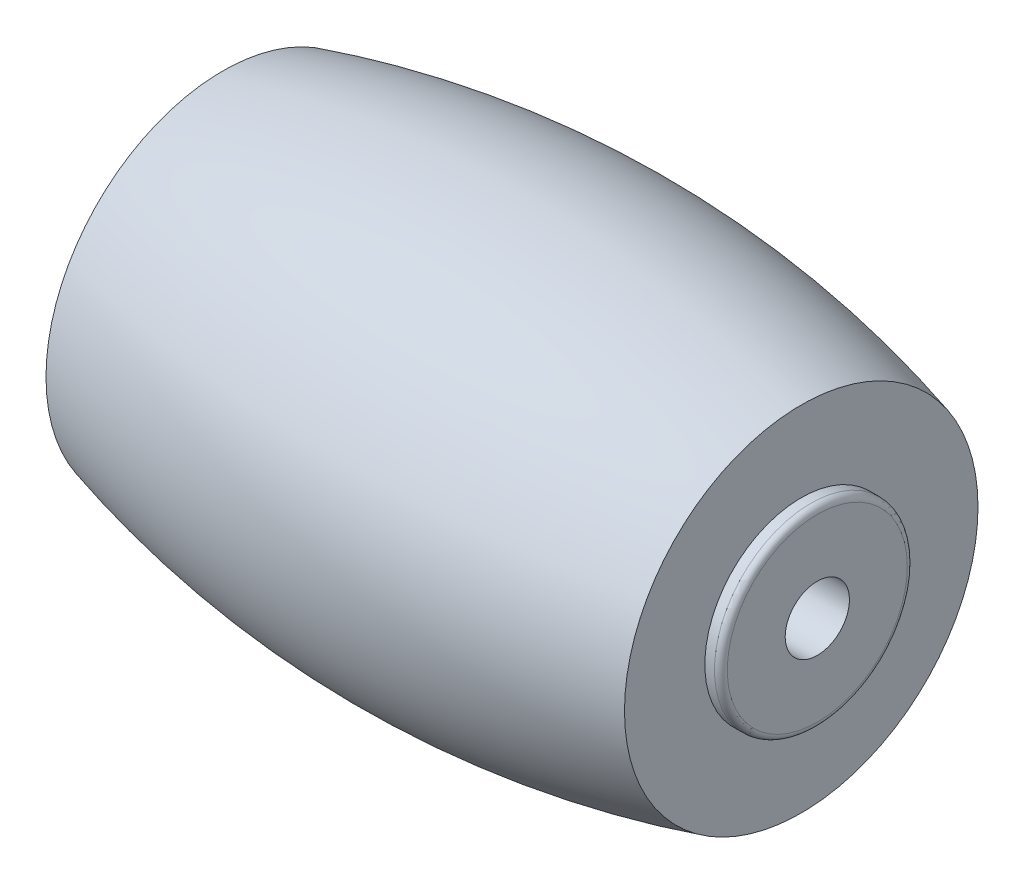
ISO-10303-21;
HEADER;
FILE_DESCRIPTION(('STEP AP214'),'2;1');
FILE_NAME('part.step','',(''),(''),'','','');
FILE_SCHEMA(('AUTOMOTIVE_DESIGN { 1 0 10303 214 1 1 1 1 }'));
ENDSEC;
DATA;
#1=APPLICATION_CONTEXT('core data for automotive mechanical design processes');
#2=APPLICATION_PROTOCOL_DEFINITION('international standard','automotive_design',2000,#1);
#3=PRODUCT_CONTEXT('',#1,'mechanical');
#4=PRODUCT('Part','Part','',(#3));
#5=PRODUCT_RELATED_PRODUCT_CATEGORY('part','',(#4));
#6=PRODUCT_DEFINITION_FORMATION('','',#4);
#7=PRODUCT_DEFINITION_CONTEXT('part definition',#1,'design');
#8=PRODUCT_DEFINITION('design','',#6,#7);
#9=PRODUCT_DEFINITION_SHAPE('','',#8);
#10=(LENGTH_UNIT() NAMED_UNIT(*) SI_UNIT(.MILLI.,.METRE.));
#11=(NAMED_UNIT(*) PLANE_ANGLE_UNIT() SI_UNIT($,.RADIAN.));
#12=(NAMED_UNIT(*) SI_UNIT($,.STERADIAN.) SOLID_ANGLE_UNIT());
#13=UNCERTAINTY_MEASURE_WITH_UNIT(LENGTH_MEASURE(1.E-05),#10,'distance_accuracy_value','');
#14=(GEOMETRIC_REPRESENTATION_CONTEXT(3) GLOBAL_UNCERTAINTY_ASSIGNED_CONTEXT((#13)) GLOBAL_UNIT_ASSIGNED_CONTEXT((#10,
#11,#12)) REPRESENTATION_CONTEXT('',''));
#15=CARTESIAN_POINT('',(0.,0.,0.));
#16=DIRECTION('',(0.,0.,1.));
#17=DIRECTION('',(1.,0.,0.));
#18=AXIS2_PLACEMENT_3D('',#15,#16,#17);
#19=CARTESIAN_POINT('',(9.,0.,0.));
#20=DIRECTION('',(1.,0.,0.));
#21=DIRECTION('',(0.,0.,-1.));
#22=AXIS2_PLACEMENT_3D('',#19,#20,#21);
#23=PLANE('',#22);
#24=CARTESIAN_POINT('',(9.,0.,0.));
#25=DIRECTION('',(1.,0.,0.));
#26=DIRECTION('',(0.,0.,-1.));
#27=AXIS2_PLACEMENT_3D('',#24,#25,#26);
#28=CIRCLE('',#27,3.);
#29=CARTESIAN_POINT('',(9.,0.,-3.));
#30=VERTEX_POINT('',#29);
#31=EDGE_CURVE('E61',#30,#30,#28,.T.);
#32=ORIENTED_EDGE('',*,*,#31,.F.);
#33=EDGE_LOOP('',(#32));
#34=FACE_BOUND('',#33,.T.);
#35=CARTESIAN_POINT('',(9.,0.,0.));
#36=DIRECTION('',(1.,0.,0.));
#37=DIRECTION('',(0.,0.,-1.));
#38=AXIS2_PLACEMENT_3D('',#35,#36,#37);
#39=CIRCLE('',#38,5.5);
#40=CARTESIAN_POINT('',(9.,0.,-5.5));
#41=VERTEX_POINT('',#40);
#42=EDGE_CURVE('E66',#41,#41,#39,.T.);
#43=ORIENTED_EDGE('',*,*,#42,.T.);
#44=EDGE_LOOP('',(#43));
#45=FACE_BOUND('',#44,.T.);
#46=ADVANCED_FACE('F37',(#34,#45),#23,.T.);
#47=CARTESIAN_POINT('',(-9.,0.,0.));
#48=DIRECTION('',(-1.,0.,0.));
#49=DIRECTION('',(0.,0.,1.));
#50=AXIS2_PLACEMENT_3D('',#47,#48,#49);
#51=PLANE('',#50);
#52=CARTESIAN_POINT('',(-9.,0.,0.));
#53=DIRECTION('',(1.,0.,0.));
#54=DIRECTION('',(0.,0.,-1.));
#55=AXIS2_PLACEMENT_3D('',#52,#53,#54);
#56=CIRCLE('',#55,3.);
#57=CARTESIAN_POINT('',(-9.,0.,-3.));
#58=VERTEX_POINT('',#57);
#59=EDGE_CURVE('E70',#58,#58,#56,.T.);
#60=ORIENTED_EDGE('',*,*,#59,.T.);
#61=EDGE_LOOP('',(#60));
#62=FACE_BOUND('',#61,.T.);
#63=CARTESIAN_POINT('',(-9.,0.,0.));
#64=DIRECTION('',(1.,0.,0.));
#65=DIRECTION('',(0.,0.,-1.));
#66=AXIS2_PLACEMENT_3D('',#63,#64,#65);
#67=CIRCLE('',#66,5.5);
#68=CARTESIAN_POINT('',(-9.,0.,-5.5));
#69=VERTEX_POINT('',#68);
#70=EDGE_CURVE('E62',#69,#69,#67,.T.);
#71=ORIENTED_EDGE('',*,*,#70,.F.);
#72=EDGE_LOOP('',(#71));
#73=FACE_BOUND('',#72,.T.);
#74=ADVANCED_FACE('F104',(#62,#73),#51,.T.);
#75=CARTESIAN_POINT('',(0.,0.,0.));
#76=DIRECTION('',(1.,0.,0.));
#77=DIRECTION('',(0.,0.,-1.));
#78=AXIS2_PLACEMENT_3D('',#75,#76,#77);
#79=DEGENERATE_TOROIDAL_SURFACE('',#78,26.7836447571631,33.5146791541663,.F.);
#80=ORIENTED_EDGE('',*,*,#70,.T.);
#81=EDGE_LOOP('',(#80));
#82=FACE_BOUND('',#81,.T.);
#83=ORIENTED_EDGE('',*,*,#42,.F.);
#84=EDGE_LOOP('',(#83));
#85=FACE_BOUND('',#84,.T.);
#86=ADVANCED_FACE('F110',(#82,#85),#79,.F.);
#87=CARTESIAN_POINT('',(9.5,0.,0.));
#88=DIRECTION('',(-1.,0.,0.));
#89=DIRECTION('',(0.,0.,1.));
#90=AXIS2_PLACEMENT_3D('',#87,#88,#89);
#91=CYLINDRICAL_SURFACE('',#90,3.);
#92=CARTESIAN_POINT('',(9.3,0.,0.));
#93=DIRECTION('',(1.,0.,0.));
#94=DIRECTION('',(0.,0.,-1.));
#95=AXIS2_PLACEMENT_3D('',#92,#93,#94);
#96=CIRCLE('',#95,3.);
#97=CARTESIAN_POINT('',(9.3,0.,-3.));
#98=VERTEX_POINT('',#97);
#99=EDGE_CURVE('E50',#98,#98,#96,.F.);
#100=ORIENTED_EDGE('',*,*,#99,.T.);
#101=EDGE_LOOP('',(#100));
#102=FACE_BOUND('',#101,.T.);
#103=ORIENTED_EDGE('',*,*,#31,.T.);
#104=EDGE_LOOP('',(#103));
#105=FACE_BOUND('',#104,.T.);
#106=ADVANCED_FACE('F127',(#102,#105),#91,.T.);
#107=CARTESIAN_POINT('',(9.5,0.,0.));
#108=DIRECTION('',(1.,0.,0.));
#109=DIRECTION('',(0.,0.,-1.));
#110=AXIS2_PLACEMENT_3D('',#107,#108,#109);
#111=PLANE('',#110);
#112=CARTESIAN_POINT('',(9.5,0.,0.));
#113=DIRECTION('',(1.,0.,0.));
#114=DIRECTION('',(0.,0.,-1.));
#115=AXIS2_PLACEMENT_3D('',#112,#113,#114);
#116=CIRCLE('',#115,2.8);
#117=CARTESIAN_POINT('',(9.5,0.,-2.8));
#118=VERTEX_POINT('',#117);
#119=EDGE_CURVE('E55',#118,#118,#116,.T.);
#120=ORIENTED_EDGE('',*,*,#119,.T.);
#121=EDGE_LOOP('',(#120));
#122=FACE_BOUND('',#121,.T.);
#123=CARTESIAN_POINT('',(9.5,0.,0.));
#124=DIRECTION('',(-1.,0.,0.));
#125=DIRECTION('',(0.,0.,1.));
#126=AXIS2_PLACEMENT_3D('',#123,#124,#125);
#127=CIRCLE('',#126,1.);
#128=CARTESIAN_POINT('',(9.5,0.,1.));
#129=VERTEX_POINT('',#128);
#130=EDGE_CURVE('E77',#129,#129,#127,.T.);
#131=ORIENTED_EDGE('',*,*,#130,.T.);
#132=EDGE_LOOP('',(#131));
#133=FACE_BOUND('',#132,.T.);
#134=ADVANCED_FACE('F86',(#122,#133),#111,.T.);
#135=CARTESIAN_POINT('',(-9.5,0.,0.));
#136=DIRECTION('',(1.,0.,0.));
#137=DIRECTION('',(0.,0.,-1.));
#138=AXIS2_PLACEMENT_3D('',#135,#136,#137);
#139=CYLINDRICAL_SURFACE('',#138,3.);
#140=CARTESIAN_POINT('',(-9.3,0.,0.));
#141=DIRECTION('',(-1.,0.,0.));
#142=DIRECTION('',(0.,0.,1.));
#143=AXIS2_PLACEMENT_3D('',#140,#141,#142);
#144=CIRCLE('',#143,3.);
#145=CARTESIAN_POINT('',(-9.3,0.,3.));
#146=VERTEX_POINT('',#145);
#147=EDGE_CURVE('E45',#146,#146,#144,.F.);
#148=ORIENTED_EDGE('',*,*,#147,.T.);
#149=EDGE_LOOP('',(#148));
#150=FACE_BOUND('',#149,.T.);
#151=ORIENTED_EDGE('',*,*,#59,.F.);
#152=EDGE_LOOP('',(#151));
#153=FACE_BOUND('',#152,.T.);
#154=ADVANCED_FACE('F97',(#150,#153),#139,.T.);
#155=CARTESIAN_POINT('',(-9.5,0.,0.));
#156=DIRECTION('',(-1.,0.,0.));
#157=DIRECTION('',(0.,0.,-1.));
#158=AXIS2_PLACEMENT_3D('',#155,#156,#157);
#159=PLANE('',#158);
#160=CARTESIAN_POINT('',(-9.5,0.,0.));
#161=DIRECTION('',(-1.,0.,0.));
#162=DIRECTION('',(0.,0.,1.));
#163=AXIS2_PLACEMENT_3D('',#160,#161,#162);
#164=CIRCLE('',#163,2.8);
#165=CARTESIAN_POINT('',(-9.5,0.,2.8));
#166=VERTEX_POINT('',#165);
#167=EDGE_CURVE('E10',#166,#166,#164,.T.);
#168=ORIENTED_EDGE('',*,*,#167,.T.);
#169=EDGE_LOOP('',(#168));
#170=FACE_BOUND('',#169,.T.);
#171=CARTESIAN_POINT('',(-9.5,0.,0.));
#172=DIRECTION('',(-1.,0.,0.));
#173=DIRECTION('',(0.,0.,1.));
#174=AXIS2_PLACEMENT_3D('',#171,#172,#173);
#175=CIRCLE('',#174,1.);
#176=CARTESIAN_POINT('',(-9.5,0.,1.));
#177=VERTEX_POINT('',#176);
#178=EDGE_CURVE('E78',#177,#177,#175,.T.);
#179=ORIENTED_EDGE('',*,*,#178,.F.);
#180=EDGE_LOOP('',(#179));
#181=FACE_BOUND('',#180,.T.);
#182=ADVANCED_FACE('F92',(#170,#181),#159,.T.);
#183=CARTESIAN_POINT('',(9.5,0.,0.));
#184=DIRECTION('',(-1.,0.,0.));
#185=DIRECTION('',(0.,0.,1.));
#186=AXIS2_PLACEMENT_3D('',#183,#184,#185);
#187=CYLINDRICAL_SURFACE('',#186,1.);
#188=ORIENTED_EDGE('',*,*,#130,.F.);
#189=EDGE_LOOP('',(#188));
#190=FACE_BOUND('',#189,.T.);
#191=ORIENTED_EDGE('',*,*,#178,.T.);
#192=EDGE_LOOP('',(#191));
#193=FACE_BOUND('',#192,.T.);
#194=ADVANCED_FACE('F88',(#190,#193),#187,.F.);
#195=CARTESIAN_POINT('',(9.3,0.,0.));
#196=DIRECTION('',(1.,0.,0.));
#197=DIRECTION('',(0.,0.,-1.));
#198=AXIS2_PLACEMENT_3D('',#195,#196,#197);
#199=TOROIDAL_SURFACE('',#198,2.8,0.2);
#200=ORIENTED_EDGE('',*,*,#99,.F.);
#201=EDGE_LOOP('',(#200));
#202=FACE_BOUND('',#201,.T.);
#203=ORIENTED_EDGE('',*,*,#119,.F.);
#204=EDGE_LOOP('',(#203));
#205=FACE_BOUND('',#204,.T.);
#206=ADVANCED_FACE('F91',(#202,#205),#199,.T.);
#207=CARTESIAN_POINT('',(-9.3,0.,0.));
#208=DIRECTION('',(-1.,0.,0.));
#209=DIRECTION('',(0.,0.,1.));
#210=AXIS2_PLACEMENT_3D('',#207,#208,#209);
#211=TOROIDAL_SURFACE('',#210,2.8,0.2);
#212=ORIENTED_EDGE('',*,*,#167,.F.);
#213=EDGE_LOOP('',(#212));
#214=FACE_BOUND('',#213,.T.);
#215=ORIENTED_EDGE('',*,*,#147,.F.);
#216=EDGE_LOOP('',(#215));
#217=FACE_BOUND('',#216,.T.);
#218=ADVANCED_FACE('F39',(#214,#217),#211,.T.);
#219=CLOSED_SHELL('',(#46,#74,#86,#106,#134,#154,#182,#194,#206,#218));
#220=MANIFOLD_SOLID_BREP('B2',#219);
#221=ADVANCED_BREP_SHAPE_REPRESENTATION('',(#18,#220),#14);
#222=SHAPE_DEFINITION_REPRESENTATION(#9,#221);
ENDSEC;
END-ISO-10303-21;
